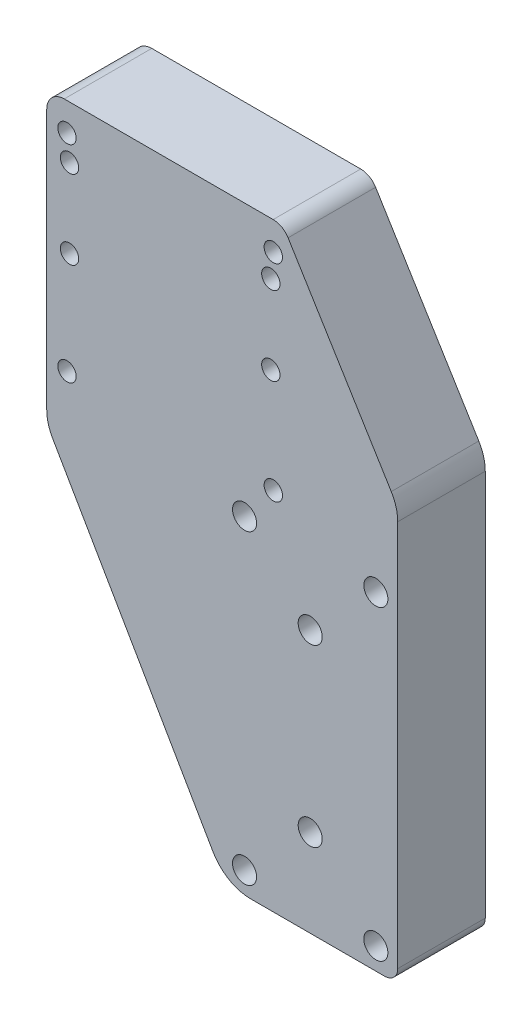
ISO-10303-21;
HEADER;
FILE_DESCRIPTION(('STEP AP214'),'2;1');
FILE_NAME('part.step','',(''),(''),'','','');
FILE_SCHEMA(('AUTOMOTIVE_DESIGN { 1 0 10303 214 1 1 1 1 }'));
ENDSEC;
DATA;
#1=APPLICATION_CONTEXT('core data for automotive mechanical design processes');
#2=APPLICATION_PROTOCOL_DEFINITION('international standard','automotive_design',2000,#1);
#3=PRODUCT_CONTEXT('',#1,'mechanical');
#4=PRODUCT('Part','Part','',(#3));
#5=PRODUCT_RELATED_PRODUCT_CATEGORY('part','',(#4));
#6=PRODUCT_DEFINITION_FORMATION('','',#4);
#7=PRODUCT_DEFINITION_CONTEXT('part definition',#1,'design');
#8=PRODUCT_DEFINITION('design','',#6,#7);
#9=PRODUCT_DEFINITION_SHAPE('','',#8);
#10=(LENGTH_UNIT() NAMED_UNIT(*) SI_UNIT(.MILLI.,.METRE.));
#11=(NAMED_UNIT(*) PLANE_ANGLE_UNIT() SI_UNIT($,.RADIAN.));
#12=(NAMED_UNIT(*) SI_UNIT($,.STERADIAN.) SOLID_ANGLE_UNIT());
#13=UNCERTAINTY_MEASURE_WITH_UNIT(LENGTH_MEASURE(1.E-05),#10,'distance_accuracy_value','');
#14=(GEOMETRIC_REPRESENTATION_CONTEXT(3) GLOBAL_UNCERTAINTY_ASSIGNED_CONTEXT((#13)) GLOBAL_UNIT_ASSIGNED_CONTEXT((#10,
#11,#12)) REPRESENTATION_CONTEXT('',''));
#15=CARTESIAN_POINT('',(0.,0.,0.));
#16=DIRECTION('',(0.,0.,1.));
#17=DIRECTION('',(1.,0.,0.));
#18=AXIS2_PLACEMENT_3D('',#15,#16,#17);
#19=CARTESIAN_POINT('',(-92.9999999999341,473.,20.));
#20=DIRECTION('',(0.,0.,-1.));
#21=DIRECTION('',(-1.,0.,0.));
#22=AXIS2_PLACEMENT_3D('',#19,#20,#21);
#23=PLANE('',#22);
#24=CARTESIAN_POINT('',(-165.570000000788,553.43000000002,20.));
#25=DIRECTION('',(0.,0.,1.));
#26=DIRECTION('',(1.,0.,0.));
#27=AXIS2_PLACEMENT_3D('',#24,#25,#26);
#28=CIRCLE('',#27,2.09999999999999);
#29=CARTESIAN_POINT('',(-163.470000000788,553.43000000002,20.));
#30=VERTEX_POINT('',#29);
#31=EDGE_CURVE('E320',#30,#30,#28,.T.);
#32=ORIENTED_EDGE('',*,*,#31,.F.);
#33=EDGE_LOOP('',(#32));
#34=FACE_BOUND('',#33,.T.);
#35=CARTESIAN_POINT('',(-165.570000000788,600.57000000002,20.));
#36=DIRECTION('',(0.,0.,1.));
#37=DIRECTION('',(1.,0.,0.));
#38=AXIS2_PLACEMENT_3D('',#35,#36,#37);
#39=CIRCLE('',#38,2.09999999999999);
#40=CARTESIAN_POINT('',(-163.470000000788,600.57000000002,20.));
#41=VERTEX_POINT('',#40);
#42=EDGE_CURVE('E322',#41,#41,#39,.T.);
#43=ORIENTED_EDGE('',*,*,#42,.F.);
#44=EDGE_LOOP('',(#43));
#45=FACE_BOUND('',#44,.T.);
#46=CARTESIAN_POINT('',(-118.430000000788,553.43000000002,20.));
#47=DIRECTION('',(0.,0.,1.));
#48=DIRECTION('',(1.,0.,0.));
#49=AXIS2_PLACEMENT_3D('',#46,#47,#48);
#50=CIRCLE('',#49,2.1);
#51=CARTESIAN_POINT('',(-116.330000000788,553.43000000002,20.));
#52=VERTEX_POINT('',#51);
#53=EDGE_CURVE('E330',#52,#52,#50,.T.);
#54=ORIENTED_EDGE('',*,*,#53,.F.);
#55=EDGE_LOOP('',(#54));
#56=FACE_BOUND('',#55,.T.);
#57=CARTESIAN_POINT('',(-118.430000000788,600.57000000002,20.));
#58=DIRECTION('',(0.,0.,1.));
#59=DIRECTION('',(1.,0.,0.));
#60=AXIS2_PLACEMENT_3D('',#57,#58,#59);
#61=CIRCLE('',#60,2.1);
#62=CARTESIAN_POINT('',(-116.330000000788,600.57000000002,20.));
#63=VERTEX_POINT('',#62);
#64=EDGE_CURVE('E336',#63,#63,#61,.T.);
#65=ORIENTED_EDGE('',*,*,#64,.F.);
#66=EDGE_LOOP('',(#65));
#67=FACE_BOUND('',#66,.T.);
#68=CARTESIAN_POINT('',(-94.999999999934,544.999999999999,20.));
#69=DIRECTION('',(0.,0.,1.));
#70=DIRECTION('',(1.,0.,0.));
#71=AXIS2_PLACEMENT_3D('',#68,#69,#70);
#72=CIRCLE('',#71,2.75);
#73=CARTESIAN_POINT('',(-92.249999999934,544.999999999999,20.));
#74=VERTEX_POINT('',#73);
#75=EDGE_CURVE('E342',#74,#74,#72,.T.);
#76=ORIENTED_EDGE('',*,*,#75,.F.);
#77=EDGE_LOOP('',(#76));
#78=FACE_BOUND('',#77,.T.);
#79=CARTESIAN_POINT('',(-124.999999999934,544.999999999999,20.));
#80=DIRECTION('',(0.,0.,1.));
#81=DIRECTION('',(1.,0.,0.));
#82=AXIS2_PLACEMENT_3D('',#79,#80,#81);
#83=CIRCLE('',#82,2.75);
#84=CARTESIAN_POINT('',(-122.249999999934,544.999999999999,20.));
#85=VERTEX_POINT('',#84);
#86=EDGE_CURVE('E348',#85,#85,#83,.T.);
#87=ORIENTED_EDGE('',*,*,#86,.F.);
#88=EDGE_LOOP('',(#87));
#89=FACE_BOUND('',#88,.T.);
#90=CARTESIAN_POINT('',(-94.999999999934,475.,20.));
#91=DIRECTION('',(0.,0.,1.));
#92=DIRECTION('',(1.,0.,0.));
#93=AXIS2_PLACEMENT_3D('',#90,#91,#92);
#94=CIRCLE('',#93,2.75);
#95=CARTESIAN_POINT('',(-92.249999999934,475.,20.));
#96=VERTEX_POINT('',#95);
#97=EDGE_CURVE('E360',#96,#96,#94,.T.);
#98=ORIENTED_EDGE('',*,*,#97,.F.);
#99=EDGE_LOOP('',(#98));
#100=FACE_BOUND('',#99,.T.);
#101=CARTESIAN_POINT('',(-109.999999999934,490.,20.));
#102=DIRECTION('',(0.,0.,1.));
#103=DIRECTION('',(1.,0.,0.));
#104=AXIS2_PLACEMENT_3D('',#101,#102,#103);
#105=CIRCLE('',#104,2.75);
#106=CARTESIAN_POINT('',(-107.249999999934,490.,20.));
#107=VERTEX_POINT('',#106);
#108=EDGE_CURVE('E366',#107,#107,#105,.T.);
#109=ORIENTED_EDGE('',*,*,#108,.F.);
#110=EDGE_LOOP('',(#109));
#111=FACE_BOUND('',#110,.T.);
#112=CARTESIAN_POINT('',(-109.999999999934,530.,20.));
#113=DIRECTION('',(0.,0.,1.));
#114=DIRECTION('',(1.,0.,0.));
#115=AXIS2_PLACEMENT_3D('',#112,#113,#114);
#116=CIRCLE('',#115,2.75);
#117=CARTESIAN_POINT('',(-107.249999999934,530.,20.));
#118=VERTEX_POINT('',#117);
#119=EDGE_CURVE('E372',#118,#118,#116,.T.);
#120=ORIENTED_EDGE('',*,*,#119,.F.);
#121=EDGE_LOOP('',(#120));
#122=FACE_BOUND('',#121,.T.);
#123=CARTESIAN_POINT('',(-119.000000000783,595.000000000015,20.));
#124=DIRECTION('',(0.,0.,-1.));
#125=DIRECTION('',(-1.,0.,0.));
#126=AXIS2_PLACEMENT_3D('',#123,#124,#125);
#127=CIRCLE('',#126,2.09999999999999);
#128=CARTESIAN_POINT('',(-121.100000000783,595.000000000015,20.));
#129=VERTEX_POINT('',#128);
#130=EDGE_CURVE('E381',#129,#129,#127,.T.);
#131=ORIENTED_EDGE('',*,*,#130,.T.);
#132=EDGE_LOOP('',(#131));
#133=FACE_BOUND('',#132,.T.);
#134=CARTESIAN_POINT('',(-119.000000000783,577.000000000015,20.));
#135=DIRECTION('',(0.,0.,-1.));
#136=DIRECTION('',(-1.,0.,0.));
#137=AXIS2_PLACEMENT_3D('',#134,#135,#136);
#138=CIRCLE('',#137,2.09999999999999);
#139=CARTESIAN_POINT('',(-121.100000000783,577.000000000015,20.));
#140=VERTEX_POINT('',#139);
#141=EDGE_CURVE('E387',#140,#140,#138,.T.);
#142=ORIENTED_EDGE('',*,*,#141,.T.);
#143=EDGE_LOOP('',(#142));
#144=FACE_BOUND('',#143,.T.);
#145=CARTESIAN_POINT('',(-165.000000000784,577.000000000014,20.));
#146=DIRECTION('',(0.,0.,-1.));
#147=DIRECTION('',(-1.,0.,0.));
#148=AXIS2_PLACEMENT_3D('',#145,#146,#147);
#149=CIRCLE('',#148,2.09999999999999);
#150=CARTESIAN_POINT('',(-167.100000000784,577.000000000014,20.));
#151=VERTEX_POINT('',#150);
#152=EDGE_CURVE('E393',#151,#151,#149,.T.);
#153=ORIENTED_EDGE('',*,*,#152,.T.);
#154=EDGE_LOOP('',(#153));
#155=FACE_BOUND('',#154,.T.);
#156=CARTESIAN_POINT('',(-165.000000000783,595.000000000014,20.));
#157=DIRECTION('',(0.,0.,-1.));
#158=DIRECTION('',(-1.,0.,0.));
#159=AXIS2_PLACEMENT_3D('',#156,#157,#158);
#160=CIRCLE('',#159,2.09999999999999);
#161=CARTESIAN_POINT('',(-167.100000000783,595.000000000014,20.));
#162=VERTEX_POINT('',#161);
#163=EDGE_CURVE('E162',#162,#162,#160,.T.);
#164=ORIENTED_EDGE('',*,*,#163,.T.);
#165=EDGE_LOOP('',(#164));
#166=FACE_BOUND('',#165,.T.);
#167=DIRECTION('',(-0.522952630183533,0.852361746316741,0.));
#168=VECTOR('',#167,1.);
#169=CARTESIAN_POINT('',(-116.22532923768,606.999999999993,20.));
#170=LINE('',#169,#168);
#171=CARTESIAN_POINT('',(-91.4763825367658,566.661632408099,20.));
#172=VERTEX_POINT('',#171);
#173=CARTESIAN_POINT('',(-115.054590743862,605.091810520727,20.));
#174=VERTEX_POINT('',#173);
#175=EDGE_CURVE('E153',#172,#174,#170,.T.);
#176=ORIENTED_EDGE('',*,*,#175,.T.);
#177=CARTESIAN_POINT('',(-118.464037729129,602.999999999993,20.));
#178=DIRECTION('',(0.,0.,-1.));
#179=DIRECTION('',(-1.,0.,0.));
#180=AXIS2_PLACEMENT_3D('',#177,#178,#179);
#181=CIRCLE('',#180,4.);
#182=CARTESIAN_POINT('',(-118.464037729129,606.999999999993,20.));
#183=VERTEX_POINT('',#182);
#184=EDGE_CURVE('E41',#174,#183,#181,.F.);
#185=ORIENTED_EDGE('',*,*,#184,.T.);
#186=DIRECTION('',(-1.,0.,0.));
#187=VECTOR('',#186,1.);
#188=CARTESIAN_POINT('',(-170.200000000702,606.999999999993,20.));
#189=LINE('',#188,#187);
#190=CARTESIAN_POINT('',(-166.200000000702,606.999999999993,20.));
#191=VERTEX_POINT('',#190);
#192=EDGE_CURVE('E175',#183,#191,#189,.T.);
#193=ORIENTED_EDGE('',*,*,#192,.T.);
#194=CARTESIAN_POINT('',(-166.200000000702,602.999999999993,20.));
#195=DIRECTION('',(0.,0.,-1.));
#196=DIRECTION('',(-1.,0.,0.));
#197=AXIS2_PLACEMENT_3D('',#194,#195,#196);
#198=CIRCLE('',#197,4.);
#199=CARTESIAN_POINT('',(-170.200000000702,602.999999999993,20.));
#200=VERTEX_POINT('',#199);
#201=EDGE_CURVE('E48',#191,#200,#198,.F.);
#202=ORIENTED_EDGE('',*,*,#201,.T.);
#203=DIRECTION('',(0.,-1.,0.));
#204=VECTOR('',#203,1.);
#205=CARTESIAN_POINT('',(-170.200000000702,540.82459488831,20.));
#206=LINE('',#205,#204);
#207=CARTESIAN_POINT('',(-170.200000000702,543.504086812621,20.));
#208=VERTEX_POINT('',#207);
#209=EDGE_CURVE('E221',#200,#208,#206,.T.);
#210=ORIENTED_EDGE('',*,*,#209,.T.);
#211=CARTESIAN_POINT('',(-160.200000000702,543.504086812621,20.));
#212=DIRECTION('',(0.,0.,-1.));
#213=DIRECTION('',(-1.,0.,0.));
#214=AXIS2_PLACEMENT_3D('',#211,#212,#213);
#215=CIRCLE('',#214,10.);
#216=CARTESIAN_POINT('',(-168.860254038547,538.504086812621,20.));
#217=VERTEX_POINT('',#216);
#218=EDGE_CURVE('E192',#208,#217,#215,.F.);
#219=ORIENTED_EDGE('',*,*,#218,.T.);
#220=DIRECTION('',(0.5,-0.866025403784438,0.));
#221=VECTOR('',#220,1.);
#222=CARTESIAN_POINT('',(-170.200000000702,540.82459488831,20.));
#223=LINE('',#222,#221);
#224=CARTESIAN_POINT('',(-132.196152422639,475.000000000001,20.));
#225=VERTEX_POINT('',#224);
#226=EDGE_CURVE('E136',#217,#225,#223,.T.);
#227=ORIENTED_EDGE('',*,*,#226,.T.);
#228=CARTESIAN_POINT('',(-123.535898384794,480.000000000001,20.));
#229=DIRECTION('',(0.,0.,-1.));
#230=DIRECTION('',(-1.,0.,0.));
#231=AXIS2_PLACEMENT_3D('',#228,#229,#230);
#232=CIRCLE('',#231,10.);
#233=CARTESIAN_POINT('',(-123.535898384794,470.000000000001,20.));
#234=VERTEX_POINT('',#233);
#235=EDGE_CURVE('E132',#225,#234,#232,.F.);
#236=ORIENTED_EDGE('',*,*,#235,.T.);
#237=DIRECTION('',(1.,0.,0.));
#238=VECTOR('',#237,1.);
#239=CARTESIAN_POINT('',(-129.30940107669,470.000000000001,20.));
#240=LINE('',#239,#238);
#241=CARTESIAN_POINT('',(-92.9999999999341,470.,20.));
#242=VERTEX_POINT('',#241);
#243=EDGE_CURVE('E123',#234,#242,#240,.T.);
#244=ORIENTED_EDGE('',*,*,#243,.T.);
#245=CARTESIAN_POINT('',(-92.9999999999341,473.,20.));
#246=DIRECTION('',(0.,0.,1.));
#247=DIRECTION('',(-1.,0.,0.));
#248=AXIS2_PLACEMENT_3D('',#245,#246,#247);
#249=CIRCLE('',#248,3.);
#250=CARTESIAN_POINT('',(-89.9999999999341,473.,20.));
#251=VERTEX_POINT('',#250);
#252=EDGE_CURVE('E128',#242,#251,#249,.T.);
#253=ORIENTED_EDGE('',*,*,#252,.T.);
#254=DIRECTION('',(0.,1.,0.));
#255=VECTOR('',#254,1.);
#256=CARTESIAN_POINT('',(-89.9999999999341,473.,20.));
#257=LINE('',#256,#255);
#258=CARTESIAN_POINT('',(-89.9999999999332,561.432106106264,20.));
#259=VERTEX_POINT('',#258);
#260=EDGE_CURVE('E151',#251,#259,#257,.T.);
#261=ORIENTED_EDGE('',*,*,#260,.T.);
#262=CARTESIAN_POINT('',(-99.9999999999332,561.432106106264,20.));
#263=DIRECTION('',(0.,0.,-1.));
#264=DIRECTION('',(-1.,0.,0.));
#265=AXIS2_PLACEMENT_3D('',#262,#263,#264);
#266=CIRCLE('',#265,10.);
#267=EDGE_CURVE('E190',#259,#172,#266,.F.);
#268=ORIENTED_EDGE('',*,*,#267,.T.);
#269=EDGE_LOOP('',(#176,#185,#193,#202,#210,#219,#227,#236,#244,#253,#261,#268));
#270=FACE_BOUND('',#269,.T.);
#271=CARTESIAN_POINT('',(-124.999999999934,475.,20.));
#272=DIRECTION('',(0.,0.,1.));
#273=DIRECTION('',(1.,0.,0.));
#274=AXIS2_PLACEMENT_3D('',#271,#272,#273);
#275=CIRCLE('',#274,2.75);
#276=CARTESIAN_POINT('',(-122.249999999934,475.,20.));
#277=VERTEX_POINT('',#276);
#278=EDGE_CURVE('E354',#277,#277,#275,.T.);
#279=ORIENTED_EDGE('',*,*,#278,.F.);
#280=EDGE_LOOP('',(#279));
#281=FACE_BOUND('',#280,.T.);
#282=ADVANCED_FACE('F33',(#34,#45,#56,#67,#78,#89,#100,#111,#122,#133,#144,#155,#166,#270,#281),
#23,.F.);
#283=CARTESIAN_POINT('',(-92.9999999999341,473.,0.));
#284=DIRECTION('',(0.,0.,-1.));
#285=DIRECTION('',(-1.,0.,0.));
#286=AXIS2_PLACEMENT_3D('',#283,#284,#285);
#287=PLANE('',#286);
#288=CARTESIAN_POINT('',(-165.570000000788,553.43000000002,0.));
#289=DIRECTION('',(0.,0.,1.));
#290=DIRECTION('',(1.,0.,0.));
#291=AXIS2_PLACEMENT_3D('',#288,#289,#290);
#292=CIRCLE('',#291,2.09999999999999);
#293=CARTESIAN_POINT('',(-163.470000000788,553.43000000002,0.));
#294=VERTEX_POINT('',#293);
#295=EDGE_CURVE('E318',#294,#294,#292,.T.);
#296=ORIENTED_EDGE('',*,*,#295,.T.);
#297=EDGE_LOOP('',(#296));
#298=FACE_BOUND('',#297,.T.);
#299=CARTESIAN_POINT('',(-165.570000000788,600.57000000002,0.));
#300=DIRECTION('',(0.,0.,1.));
#301=DIRECTION('',(1.,0.,0.));
#302=AXIS2_PLACEMENT_3D('',#299,#300,#301);
#303=CIRCLE('',#302,2.09999999999999);
#304=CARTESIAN_POINT('',(-163.470000000788,600.57000000002,0.));
#305=VERTEX_POINT('',#304);
#306=EDGE_CURVE('E327',#305,#305,#303,.T.);
#307=ORIENTED_EDGE('',*,*,#306,.T.);
#308=EDGE_LOOP('',(#307));
#309=FACE_BOUND('',#308,.T.);
#310=CARTESIAN_POINT('',(-118.430000000788,553.43000000002,0.));
#311=DIRECTION('',(0.,0.,1.));
#312=DIRECTION('',(1.,0.,0.));
#313=AXIS2_PLACEMENT_3D('',#310,#311,#312);
#314=CIRCLE('',#313,2.09999999999999);
#315=CARTESIAN_POINT('',(-116.330000000788,553.43000000002,0.));
#316=VERTEX_POINT('',#315);
#317=EDGE_CURVE('E333',#316,#316,#314,.T.);
#318=ORIENTED_EDGE('',*,*,#317,.T.);
#319=EDGE_LOOP('',(#318));
#320=FACE_BOUND('',#319,.T.);
#321=CARTESIAN_POINT('',(-118.430000000788,600.57000000002,0.));
#322=DIRECTION('',(0.,0.,1.));
#323=DIRECTION('',(1.,0.,0.));
#324=AXIS2_PLACEMENT_3D('',#321,#322,#323);
#325=CIRCLE('',#324,2.09999999999999);
#326=CARTESIAN_POINT('',(-116.330000000788,600.57000000002,0.));
#327=VERTEX_POINT('',#326);
#328=EDGE_CURVE('E339',#327,#327,#325,.T.);
#329=ORIENTED_EDGE('',*,*,#328,.T.);
#330=EDGE_LOOP('',(#329));
#331=FACE_BOUND('',#330,.T.);
#332=CARTESIAN_POINT('',(-94.999999999934,544.999999999999,0.));
#333=DIRECTION('',(0.,0.,1.));
#334=DIRECTION('',(1.,0.,0.));
#335=AXIS2_PLACEMENT_3D('',#332,#333,#334);
#336=CIRCLE('',#335,2.74999999999999);
#337=CARTESIAN_POINT('',(-92.249999999934,544.999999999999,0.));
#338=VERTEX_POINT('',#337);
#339=EDGE_CURVE('E345',#338,#338,#336,.T.);
#340=ORIENTED_EDGE('',*,*,#339,.T.);
#341=EDGE_LOOP('',(#340));
#342=FACE_BOUND('',#341,.T.);
#343=CARTESIAN_POINT('',(-124.999999999934,544.999999999999,0.));
#344=DIRECTION('',(0.,0.,1.));
#345=DIRECTION('',(1.,0.,0.));
#346=AXIS2_PLACEMENT_3D('',#343,#344,#345);
#347=CIRCLE('',#346,2.74999999999999);
#348=CARTESIAN_POINT('',(-122.249999999934,544.999999999999,0.));
#349=VERTEX_POINT('',#348);
#350=EDGE_CURVE('E351',#349,#349,#347,.T.);
#351=ORIENTED_EDGE('',*,*,#350,.T.);
#352=EDGE_LOOP('',(#351));
#353=FACE_BOUND('',#352,.T.);
#354=CARTESIAN_POINT('',(-124.999999999934,475.,0.));
#355=DIRECTION('',(0.,0.,1.));
#356=DIRECTION('',(1.,0.,0.));
#357=AXIS2_PLACEMENT_3D('',#354,#355,#356);
#358=CIRCLE('',#357,2.74999999999999);
#359=CARTESIAN_POINT('',(-122.249999999934,475.,0.));
#360=VERTEX_POINT('',#359);
#361=EDGE_CURVE('E357',#360,#360,#358,.T.);
#362=ORIENTED_EDGE('',*,*,#361,.T.);
#363=EDGE_LOOP('',(#362));
#364=FACE_BOUND('',#363,.T.);
#365=CARTESIAN_POINT('',(-94.999999999934,475.,0.));
#366=DIRECTION('',(0.,0.,1.));
#367=DIRECTION('',(1.,0.,0.));
#368=AXIS2_PLACEMENT_3D('',#365,#366,#367);
#369=CIRCLE('',#368,2.74999999999999);
#370=CARTESIAN_POINT('',(-92.249999999934,475.,0.));
#371=VERTEX_POINT('',#370);
#372=EDGE_CURVE('E363',#371,#371,#369,.T.);
#373=ORIENTED_EDGE('',*,*,#372,.T.);
#374=EDGE_LOOP('',(#373));
#375=FACE_BOUND('',#374,.T.);
#376=DIRECTION('',(-1.,0.,0.));
#377=VECTOR('',#376,1.);
#378=CARTESIAN_POINT('',(-170.200000000702,606.999999999993,0.));
#379=LINE('',#378,#377);
#380=CARTESIAN_POINT('',(-118.464037729129,606.999999999993,0.));
#381=VERTEX_POINT('',#380);
#382=CARTESIAN_POINT('',(-166.200000000702,606.999999999993,0.));
#383=VERTEX_POINT('',#382);
#384=EDGE_CURVE('E158',#381,#383,#379,.T.);
#385=ORIENTED_EDGE('',*,*,#384,.F.);
#386=CARTESIAN_POINT('',(-118.464037729129,602.999999999993,0.));
#387=DIRECTION('',(0.,0.,-1.));
#388=DIRECTION('',(-1.,0.,0.));
#389=AXIS2_PLACEMENT_3D('',#386,#387,#388);
#390=CIRCLE('',#389,4.);
#391=CARTESIAN_POINT('',(-115.054590743862,605.091810520727,0.));
#392=VERTEX_POINT('',#391);
#393=EDGE_CURVE('E210',#381,#392,#390,.T.);
#394=ORIENTED_EDGE('',*,*,#393,.T.);
#395=DIRECTION('',(-0.522952630183533,0.852361746316741,0.));
#396=VECTOR('',#395,1.);
#397=CARTESIAN_POINT('',(-116.22532923768,606.999999999993,0.));
#398=LINE('',#397,#396);
#399=CARTESIAN_POINT('',(-91.4763825367658,566.661632408099,0.));
#400=VERTEX_POINT('',#399);
#401=EDGE_CURVE('E173',#400,#392,#398,.T.);
#402=ORIENTED_EDGE('',*,*,#401,.F.);
#403=CARTESIAN_POINT('',(-99.9999999999332,561.432106106264,0.));
#404=DIRECTION('',(0.,0.,-1.));
#405=DIRECTION('',(-1.,0.,0.));
#406=AXIS2_PLACEMENT_3D('',#403,#404,#405);
#407=CIRCLE('',#406,10.);
#408=CARTESIAN_POINT('',(-89.9999999999332,561.432106106264,0.));
#409=VERTEX_POINT('',#408);
#410=EDGE_CURVE('E178',#400,#409,#407,.T.);
#411=ORIENTED_EDGE('',*,*,#410,.T.);
#412=DIRECTION('',(0.,1.,0.));
#413=VECTOR('',#412,1.);
#414=CARTESIAN_POINT('',(-89.9999999999341,473.,0.));
#415=LINE('',#414,#413);
#416=CARTESIAN_POINT('',(-89.9999999999341,473.,0.));
#417=VERTEX_POINT('',#416);
#418=EDGE_CURVE('E170',#417,#409,#415,.T.);
#419=ORIENTED_EDGE('',*,*,#418,.F.);
#420=CARTESIAN_POINT('',(-92.9999999999341,473.,0.));
#421=DIRECTION('',(0.,0.,1.));
#422=DIRECTION('',(-1.,0.,0.));
#423=AXIS2_PLACEMENT_3D('',#420,#421,#422);
#424=CIRCLE('',#423,3.);
#425=CARTESIAN_POINT('',(-92.9999999999341,470.,0.));
#426=VERTEX_POINT('',#425);
#427=EDGE_CURVE('E168',#426,#417,#424,.T.);
#428=ORIENTED_EDGE('',*,*,#427,.F.);
#429=DIRECTION('',(1.,0.,0.));
#430=VECTOR('',#429,1.);
#431=CARTESIAN_POINT('',(-129.30940107669,470.000000000001,0.));
#432=LINE('',#431,#430);
#433=CARTESIAN_POINT('',(-123.535898384794,470.000000000001,0.));
#434=VERTEX_POINT('',#433);
#435=EDGE_CURVE('E142',#434,#426,#432,.T.);
#436=ORIENTED_EDGE('',*,*,#435,.F.);
#437=CARTESIAN_POINT('',(-123.535898384794,480.000000000001,0.));
#438=DIRECTION('',(0.,0.,-1.));
#439=DIRECTION('',(-1.,0.,0.));
#440=AXIS2_PLACEMENT_3D('',#437,#438,#439);
#441=CIRCLE('',#440,10.);
#442=CARTESIAN_POINT('',(-132.196152422639,475.000000000001,0.));
#443=VERTEX_POINT('',#442);
#444=EDGE_CURVE('E183',#434,#443,#441,.T.);
#445=ORIENTED_EDGE('',*,*,#444,.T.);
#446=DIRECTION('',(0.5,-0.866025403784438,0.));
#447=VECTOR('',#446,1.);
#448=CARTESIAN_POINT('',(-170.200000000702,540.82459488831,0.));
#449=LINE('',#448,#447);
#450=CARTESIAN_POINT('',(-168.860254038547,538.504086812621,0.));
#451=VERTEX_POINT('',#450);
#452=EDGE_CURVE('E164',#451,#443,#449,.T.);
#453=ORIENTED_EDGE('',*,*,#452,.F.);
#454=CARTESIAN_POINT('',(-160.200000000702,543.504086812621,0.));
#455=DIRECTION('',(0.,0.,-1.));
#456=DIRECTION('',(-1.,0.,0.));
#457=AXIS2_PLACEMENT_3D('',#454,#455,#456);
#458=CIRCLE('',#457,10.);
#459=CARTESIAN_POINT('',(-170.200000000702,543.504086812621,0.));
#460=VERTEX_POINT('',#459);
#461=EDGE_CURVE('E180',#451,#460,#458,.T.);
#462=ORIENTED_EDGE('',*,*,#461,.T.);
#463=DIRECTION('',(0.,-1.,0.));
#464=VECTOR('',#463,1.);
#465=CARTESIAN_POINT('',(-170.200000000702,540.82459488831,0.));
#466=LINE('',#465,#464);
#467=CARTESIAN_POINT('',(-170.200000000702,602.999999999993,0.));
#468=VERTEX_POINT('',#467);
#469=EDGE_CURVE('E161',#468,#460,#466,.T.);
#470=ORIENTED_EDGE('',*,*,#469,.F.);
#471=CARTESIAN_POINT('',(-166.200000000702,602.999999999993,0.));
#472=DIRECTION('',(0.,0.,-1.));
#473=DIRECTION('',(-1.,0.,0.));
#474=AXIS2_PLACEMENT_3D('',#471,#472,#473);
#475=CIRCLE('',#474,4.);
#476=EDGE_CURVE('E208',#468,#383,#475,.T.);
#477=ORIENTED_EDGE('',*,*,#476,.T.);
#478=EDGE_LOOP('',(#385,#394,#402,#411,#419,#428,#436,#445,#453,#462,#470,#477));
#479=FACE_BOUND('',#478,.T.);
#480=CARTESIAN_POINT('',(-165.000000000783,595.000000000014,0.));
#481=DIRECTION('',(0.,0.,-1.));
#482=DIRECTION('',(-1.,0.,0.));
#483=AXIS2_PLACEMENT_3D('',#480,#481,#482);
#484=CIRCLE('',#483,2.09999999999999);
#485=CARTESIAN_POINT('',(-167.100000000783,595.000000000014,0.));
#486=VERTEX_POINT('',#485);
#487=EDGE_CURVE('E396',#486,#486,#484,.T.);
#488=ORIENTED_EDGE('',*,*,#487,.F.);
#489=EDGE_LOOP('',(#488));
#490=FACE_BOUND('',#489,.T.);
#491=CARTESIAN_POINT('',(-165.000000000784,577.000000000014,0.));
#492=DIRECTION('',(0.,0.,-1.));
#493=DIRECTION('',(-1.,0.,0.));
#494=AXIS2_PLACEMENT_3D('',#491,#492,#493);
#495=CIRCLE('',#494,2.09999999999999);
#496=CARTESIAN_POINT('',(-167.100000000784,577.000000000014,0.));
#497=VERTEX_POINT('',#496);
#498=EDGE_CURVE('E390',#497,#497,#495,.T.);
#499=ORIENTED_EDGE('',*,*,#498,.F.);
#500=EDGE_LOOP('',(#499));
#501=FACE_BOUND('',#500,.T.);
#502=CARTESIAN_POINT('',(-119.000000000783,577.000000000015,0.));
#503=DIRECTION('',(0.,0.,-1.));
#504=DIRECTION('',(-1.,0.,0.));
#505=AXIS2_PLACEMENT_3D('',#502,#503,#504);
#506=CIRCLE('',#505,2.1);
#507=CARTESIAN_POINT('',(-121.100000000783,577.000000000015,0.));
#508=VERTEX_POINT('',#507);
#509=EDGE_CURVE('E384',#508,#508,#506,.T.);
#510=ORIENTED_EDGE('',*,*,#509,.F.);
#511=EDGE_LOOP('',(#510));
#512=FACE_BOUND('',#511,.T.);
#513=CARTESIAN_POINT('',(-119.000000000783,595.000000000015,0.));
#514=DIRECTION('',(0.,0.,-1.));
#515=DIRECTION('',(-1.,0.,0.));
#516=AXIS2_PLACEMENT_3D('',#513,#514,#515);
#517=CIRCLE('',#516,2.1);
#518=CARTESIAN_POINT('',(-121.100000000783,595.000000000015,0.));
#519=VERTEX_POINT('',#518);
#520=EDGE_CURVE('E378',#519,#519,#517,.T.);
#521=ORIENTED_EDGE('',*,*,#520,.F.);
#522=EDGE_LOOP('',(#521));
#523=FACE_BOUND('',#522,.T.);
#524=CARTESIAN_POINT('',(-109.999999999934,530.,0.));
#525=DIRECTION('',(0.,0.,1.));
#526=DIRECTION('',(1.,0.,0.));
#527=AXIS2_PLACEMENT_3D('',#524,#525,#526);
#528=CIRCLE('',#527,2.74999999999999);
#529=CARTESIAN_POINT('',(-107.249999999934,530.,0.));
#530=VERTEX_POINT('',#529);
#531=EDGE_CURVE('E375',#530,#530,#528,.T.);
#532=ORIENTED_EDGE('',*,*,#531,.T.);
#533=EDGE_LOOP('',(#532));
#534=FACE_BOUND('',#533,.T.);
#535=CARTESIAN_POINT('',(-109.999999999934,490.,0.));
#536=DIRECTION('',(0.,0.,1.));
#537=DIRECTION('',(1.,0.,0.));
#538=AXIS2_PLACEMENT_3D('',#535,#536,#537);
#539=CIRCLE('',#538,2.74999999999999);
#540=CARTESIAN_POINT('',(-107.249999999934,490.,0.));
#541=VERTEX_POINT('',#540);
#542=EDGE_CURVE('E369',#541,#541,#539,.T.);
#543=ORIENTED_EDGE('',*,*,#542,.T.);
#544=EDGE_LOOP('',(#543));
#545=FACE_BOUND('',#544,.T.);
#546=ADVANCED_FACE('F226',(#298,#309,#320,#331,#342,#353,#364,#375,#479,#490,#501,#512,#523,
#534,#545),#287,.T.);
#547=CARTESIAN_POINT('',(-170.200000000702,606.999999999993,20.));
#548=DIRECTION('',(0.,-1.,0.));
#549=DIRECTION('',(0.,0.,-1.));
#550=AXIS2_PLACEMENT_3D('',#547,#548,#549);
#551=PLANE('',#550);
#552=ORIENTED_EDGE('',*,*,#192,.F.);
#553=DIRECTION('',(0.,0.,-1.));
#554=VECTOR('',#553,1.);
#555=CARTESIAN_POINT('',(-118.464037729129,606.999999999993,20.));
#556=LINE('',#555,#554);
#557=EDGE_CURVE('E205',#183,#381,#556,.T.);
#558=ORIENTED_EDGE('',*,*,#557,.T.);
#559=ORIENTED_EDGE('',*,*,#384,.T.);
#560=DIRECTION('',(0.,0.,-1.));
#561=VECTOR('',#560,1.);
#562=CARTESIAN_POINT('',(-166.200000000702,606.999999999993,20.));
#563=LINE('',#562,#561);
#564=EDGE_CURVE('E203',#383,#191,#563,.F.);
#565=ORIENTED_EDGE('',*,*,#564,.T.);
#566=EDGE_LOOP('',(#552,#558,#559,#565));
#567=FACE_BOUND('',#566,.T.);
#568=ADVANCED_FACE('F218',(#567),#551,.F.);
#569=CARTESIAN_POINT('',(-170.200000000702,540.82459488831,20.));
#570=DIRECTION('',(1.,0.,0.));
#571=DIRECTION('',(0.,1.,0.));
#572=AXIS2_PLACEMENT_3D('',#569,#570,#571);
#573=PLANE('',#572);
#574=ORIENTED_EDGE('',*,*,#209,.F.);
#575=DIRECTION('',(0.,0.,-1.));
#576=VECTOR('',#575,1.);
#577=CARTESIAN_POINT('',(-170.200000000702,602.999999999993,20.));
#578=LINE('',#577,#576);
#579=EDGE_CURVE('E11',#200,#468,#578,.T.);
#580=ORIENTED_EDGE('',*,*,#579,.T.);
#581=ORIENTED_EDGE('',*,*,#469,.T.);
#582=DIRECTION('',(0.,0.,-1.));
#583=VECTOR('',#582,1.);
#584=CARTESIAN_POINT('',(-170.200000000702,543.504086812621,20.));
#585=LINE('',#584,#583);
#586=EDGE_CURVE('E195',#460,#208,#585,.F.);
#587=ORIENTED_EDGE('',*,*,#586,.T.);
#588=EDGE_LOOP('',(#574,#580,#581,#587));
#589=FACE_BOUND('',#588,.T.);
#590=ADVANCED_FACE('F414',(#589),#573,.F.);
#591=CARTESIAN_POINT('',(-170.200000000702,540.82459488831,20.));
#592=DIRECTION('',(0.866025403784438,0.5,0.));
#593=DIRECTION('',(-0.5,0.866025403784439,0.));
#594=AXIS2_PLACEMENT_3D('',#591,#592,#593);
#595=PLANE('',#594);
#596=ORIENTED_EDGE('',*,*,#452,.T.);
#597=DIRECTION('',(0.,0.,-1.));
#598=VECTOR('',#597,1.);
#599=CARTESIAN_POINT('',(-132.196152422639,475.000000000001,20.));
#600=LINE('',#599,#598);
#601=EDGE_CURVE('E188',#443,#225,#600,.F.);
#602=ORIENTED_EDGE('',*,*,#601,.T.);
#603=ORIENTED_EDGE('',*,*,#226,.F.);
#604=DIRECTION('',(0.,0.,-1.));
#605=VECTOR('',#604,1.);
#606=CARTESIAN_POINT('',(-168.860254038547,538.504086812621,20.));
#607=LINE('',#606,#605);
#608=EDGE_CURVE('E185',#217,#451,#607,.T.);
#609=ORIENTED_EDGE('',*,*,#608,.T.);
#610=EDGE_LOOP('',(#596,#602,#603,#609));
#611=FACE_BOUND('',#610,.T.);
#612=ADVANCED_FACE('F408',(#611),#595,.F.);
#613=CARTESIAN_POINT('',(-129.30940107669,470.000000000001,20.));
#614=DIRECTION('',(0.,1.,0.));
#615=DIRECTION('',(-1.,0.,0.));
#616=AXIS2_PLACEMENT_3D('',#613,#614,#615);
#617=PLANE('',#616);
#618=ORIENTED_EDGE('',*,*,#243,.F.);
#619=DIRECTION('',(0.,0.,-1.));
#620=VECTOR('',#619,1.);
#621=CARTESIAN_POINT('',(-123.535898384794,470.000000000001,20.));
#622=LINE('',#621,#620);
#623=EDGE_CURVE('E145',#234,#434,#622,.T.);
#624=ORIENTED_EDGE('',*,*,#623,.T.);
#625=ORIENTED_EDGE('',*,*,#435,.T.);
#626=DIRECTION('',(0.,0.,-1.));
#627=VECTOR('',#626,1.);
#628=CARTESIAN_POINT('',(-92.9999999999341,470.,20.));
#629=LINE('',#628,#627);
#630=EDGE_CURVE('E139',#242,#426,#629,.T.);
#631=ORIENTED_EDGE('',*,*,#630,.F.);
#632=EDGE_LOOP('',(#618,#624,#625,#631));
#633=FACE_BOUND('',#632,.T.);
#634=ADVANCED_FACE('F140',(#633),#617,.F.);
#635=CARTESIAN_POINT('',(-92.9999999999341,473.,20.));
#636=DIRECTION('',(0.,0.,-1.));
#637=DIRECTION('',(-1.,0.,0.));
#638=AXIS2_PLACEMENT_3D('',#635,#636,#637);
#639=CYLINDRICAL_SURFACE('',#638,3.);
#640=ORIENTED_EDGE('',*,*,#427,.T.);
#641=DIRECTION('',(0.,0.,-1.));
#642=VECTOR('',#641,1.);
#643=CARTESIAN_POINT('',(-89.9999999999341,473.,20.));
#644=LINE('',#643,#642);
#645=EDGE_CURVE('E146',#251,#417,#644,.T.);
#646=ORIENTED_EDGE('',*,*,#645,.F.);
#647=ORIENTED_EDGE('',*,*,#252,.F.);
#648=ORIENTED_EDGE('',*,*,#630,.T.);
#649=EDGE_LOOP('',(#640,#646,#647,#648));
#650=FACE_BOUND('',#649,.T.);
#651=ADVANCED_FACE('F148',(#650),#639,.T.);
#652=CARTESIAN_POINT('',(-89.9999999999341,473.,20.));
#653=DIRECTION('',(-1.,0.,0.));
#654=DIRECTION('',(0.,-1.,0.));
#655=AXIS2_PLACEMENT_3D('',#652,#653,#654);
#656=PLANE('',#655);
#657=ORIENTED_EDGE('',*,*,#418,.T.);
#658=DIRECTION('',(0.,0.,-1.));
#659=VECTOR('',#658,1.);
#660=CARTESIAN_POINT('',(-89.9999999999332,561.432106106264,20.));
#661=LINE('',#660,#659);
#662=EDGE_CURVE('E201',#409,#259,#661,.F.);
#663=ORIENTED_EDGE('',*,*,#662,.T.);
#664=ORIENTED_EDGE('',*,*,#260,.F.);
#665=ORIENTED_EDGE('',*,*,#645,.T.);
#666=EDGE_LOOP('',(#657,#663,#664,#665));
#667=FACE_BOUND('',#666,.T.);
#668=ADVANCED_FACE('F236',(#667),#656,.F.);
#669=CARTESIAN_POINT('',(-116.22532923768,606.999999999993,20.));
#670=DIRECTION('',(-0.852361746316741,-0.522952630183533,0.));
#671=DIRECTION('',(0.522952630183533,-0.852361746316741,0.));
#672=AXIS2_PLACEMENT_3D('',#669,#670,#671);
#673=PLANE('',#672);
#674=ORIENTED_EDGE('',*,*,#401,.T.);
#675=DIRECTION('',(0.,0.,-1.));
#676=VECTOR('',#675,1.);
#677=CARTESIAN_POINT('',(-115.054590743862,605.091810520727,20.));
#678=LINE('',#677,#676);
#679=EDGE_CURVE('E56',#392,#174,#678,.F.);
#680=ORIENTED_EDGE('',*,*,#679,.T.);
#681=ORIENTED_EDGE('',*,*,#175,.F.);
#682=DIRECTION('',(0.,0.,-1.));
#683=VECTOR('',#682,1.);
#684=CARTESIAN_POINT('',(-91.4763825367658,566.661632408099,20.));
#685=LINE('',#684,#683);
#686=EDGE_CURVE('E198',#172,#400,#685,.T.);
#687=ORIENTED_EDGE('',*,*,#686,.T.);
#688=EDGE_LOOP('',(#674,#680,#681,#687));
#689=FACE_BOUND('',#688,.T.);
#690=ADVANCED_FACE('F228',(#689),#673,.F.);
#691=CARTESIAN_POINT('',(-123.535898384794,480.000000000001,20.));
#692=DIRECTION('',(0.,0.,-1.));
#693=DIRECTION('',(-1.,0.,0.));
#694=AXIS2_PLACEMENT_3D('',#691,#692,#693);
#695=CYLINDRICAL_SURFACE('',#694,10.);
#696=ORIENTED_EDGE('',*,*,#235,.F.);
#697=ORIENTED_EDGE('',*,*,#601,.F.);
#698=ORIENTED_EDGE('',*,*,#444,.F.);
#699=ORIENTED_EDGE('',*,*,#623,.F.);
#700=EDGE_LOOP('',(#696,#697,#698,#699));
#701=FACE_BOUND('',#700,.T.);
#702=ADVANCED_FACE('F243',(#701),#695,.T.);
#703=CARTESIAN_POINT('',(-160.200000000702,543.504086812621,20.));
#704=DIRECTION('',(0.,0.,-1.));
#705=DIRECTION('',(-1.,0.,0.));
#706=AXIS2_PLACEMENT_3D('',#703,#704,#705);
#707=CYLINDRICAL_SURFACE('',#706,10.);
#708=ORIENTED_EDGE('',*,*,#218,.F.);
#709=ORIENTED_EDGE('',*,*,#586,.F.);
#710=ORIENTED_EDGE('',*,*,#461,.F.);
#711=ORIENTED_EDGE('',*,*,#608,.F.);
#712=EDGE_LOOP('',(#708,#709,#710,#711));
#713=FACE_BOUND('',#712,.T.);
#714=ADVANCED_FACE('F410',(#713),#707,.T.);
#715=CARTESIAN_POINT('',(-99.9999999999332,561.432106106264,20.));
#716=DIRECTION('',(0.,0.,-1.));
#717=DIRECTION('',(-1.,0.,0.));
#718=AXIS2_PLACEMENT_3D('',#715,#716,#717);
#719=CYLINDRICAL_SURFACE('',#718,10.);
#720=ORIENTED_EDGE('',*,*,#267,.F.);
#721=ORIENTED_EDGE('',*,*,#662,.F.);
#722=ORIENTED_EDGE('',*,*,#410,.F.);
#723=ORIENTED_EDGE('',*,*,#686,.F.);
#724=EDGE_LOOP('',(#720,#721,#722,#723));
#725=FACE_BOUND('',#724,.T.);
#726=ADVANCED_FACE('F232',(#725),#719,.T.);
#727=CARTESIAN_POINT('',(-165.000000000783,595.000000000014,0.));
#728=DIRECTION('',(0.,0.,-1.));
#729=DIRECTION('',(-1.,0.,0.));
#730=AXIS2_PLACEMENT_3D('',#727,#728,#729);
#731=CYLINDRICAL_SURFACE('',#730,2.09999999999999);
#732=ORIENTED_EDGE('',*,*,#163,.F.);
#733=EDGE_LOOP('',(#732));
#734=FACE_BOUND('',#733,.T.);
#735=ORIENTED_EDGE('',*,*,#487,.T.);
#736=EDGE_LOOP('',(#735));
#737=FACE_BOUND('',#736,.T.);
#738=ADVANCED_FACE('F257',(#734,#737),#731,.F.);
#739=CARTESIAN_POINT('',(-165.000000000784,577.000000000014,0.));
#740=DIRECTION('',(0.,0.,-1.));
#741=DIRECTION('',(-1.,0.,0.));
#742=AXIS2_PLACEMENT_3D('',#739,#740,#741);
#743=CYLINDRICAL_SURFACE('',#742,2.09999999999999);
#744=ORIENTED_EDGE('',*,*,#152,.F.);
#745=EDGE_LOOP('',(#744));
#746=FACE_BOUND('',#745,.T.);
#747=ORIENTED_EDGE('',*,*,#498,.T.);
#748=EDGE_LOOP('',(#747));
#749=FACE_BOUND('',#748,.T.);
#750=ADVANCED_FACE('F260',(#746,#749),#743,.F.);
#751=CARTESIAN_POINT('',(-119.000000000783,577.000000000015,0.));
#752=DIRECTION('',(0.,0.,-1.));
#753=DIRECTION('',(-1.,0.,0.));
#754=AXIS2_PLACEMENT_3D('',#751,#752,#753);
#755=CYLINDRICAL_SURFACE('',#754,2.1);
#756=ORIENTED_EDGE('',*,*,#141,.F.);
#757=EDGE_LOOP('',(#756));
#758=FACE_BOUND('',#757,.T.);
#759=ORIENTED_EDGE('',*,*,#509,.T.);
#760=EDGE_LOOP('',(#759));
#761=FACE_BOUND('',#760,.T.);
#762=ADVANCED_FACE('F264',(#758,#761),#755,.F.);
#763=CARTESIAN_POINT('',(-119.000000000783,595.000000000015,0.));
#764=DIRECTION('',(0.,0.,-1.));
#765=DIRECTION('',(-1.,0.,0.));
#766=AXIS2_PLACEMENT_3D('',#763,#764,#765);
#767=CYLINDRICAL_SURFACE('',#766,2.1);
#768=ORIENTED_EDGE('',*,*,#130,.F.);
#769=EDGE_LOOP('',(#768));
#770=FACE_BOUND('',#769,.T.);
#771=ORIENTED_EDGE('',*,*,#520,.T.);
#772=EDGE_LOOP('',(#771));
#773=FACE_BOUND('',#772,.T.);
#774=ADVANCED_FACE('F268',(#770,#773),#767,.F.);
#775=CARTESIAN_POINT('',(-109.999999999934,530.,20.));
#776=DIRECTION('',(0.,0.,1.));
#777=DIRECTION('',(1.,0.,0.));
#778=AXIS2_PLACEMENT_3D('',#775,#776,#777);
#779=CYLINDRICAL_SURFACE('',#778,2.75);
#780=ORIENTED_EDGE('',*,*,#531,.F.);
#781=EDGE_LOOP('',(#780));
#782=FACE_BOUND('',#781,.T.);
#783=ORIENTED_EDGE('',*,*,#119,.T.);
#784=EDGE_LOOP('',(#783));
#785=FACE_BOUND('',#784,.T.);
#786=ADVANCED_FACE('F272',(#782,#785),#779,.F.);
#787=CARTESIAN_POINT('',(-109.999999999934,490.,20.));
#788=DIRECTION('',(0.,0.,1.));
#789=DIRECTION('',(1.,0.,0.));
#790=AXIS2_PLACEMENT_3D('',#787,#788,#789);
#791=CYLINDRICAL_SURFACE('',#790,2.75);
#792=ORIENTED_EDGE('',*,*,#542,.F.);
#793=EDGE_LOOP('',(#792));
#794=FACE_BOUND('',#793,.T.);
#795=ORIENTED_EDGE('',*,*,#108,.T.);
#796=EDGE_LOOP('',(#795));
#797=FACE_BOUND('',#796,.T.);
#798=ADVANCED_FACE('F276',(#794,#797),#791,.F.);
#799=CARTESIAN_POINT('',(-94.999999999934,475.,20.));
#800=DIRECTION('',(0.,0.,1.));
#801=DIRECTION('',(1.,0.,0.));
#802=AXIS2_PLACEMENT_3D('',#799,#800,#801);
#803=CYLINDRICAL_SURFACE('',#802,2.75);
#804=ORIENTED_EDGE('',*,*,#372,.F.);
#805=EDGE_LOOP('',(#804));
#806=FACE_BOUND('',#805,.T.);
#807=ORIENTED_EDGE('',*,*,#97,.T.);
#808=EDGE_LOOP('',(#807));
#809=FACE_BOUND('',#808,.T.);
#810=ADVANCED_FACE('F280',(#806,#809),#803,.F.);
#811=CARTESIAN_POINT('',(-124.999999999934,475.,20.));
#812=DIRECTION('',(0.,0.,1.));
#813=DIRECTION('',(1.,0.,0.));
#814=AXIS2_PLACEMENT_3D('',#811,#812,#813);
#815=CYLINDRICAL_SURFACE('',#814,2.75);
#816=ORIENTED_EDGE('',*,*,#361,.F.);
#817=EDGE_LOOP('',(#816));
#818=FACE_BOUND('',#817,.T.);
#819=ORIENTED_EDGE('',*,*,#278,.T.);
#820=EDGE_LOOP('',(#819));
#821=FACE_BOUND('',#820,.T.);
#822=ADVANCED_FACE('F284',(#818,#821),#815,.F.);
#823=CARTESIAN_POINT('',(-124.999999999934,544.999999999999,20.));
#824=DIRECTION('',(0.,0.,1.));
#825=DIRECTION('',(1.,0.,0.));
#826=AXIS2_PLACEMENT_3D('',#823,#824,#825);
#827=CYLINDRICAL_SURFACE('',#826,2.75);
#828=ORIENTED_EDGE('',*,*,#350,.F.);
#829=EDGE_LOOP('',(#828));
#830=FACE_BOUND('',#829,.T.);
#831=ORIENTED_EDGE('',*,*,#86,.T.);
#832=EDGE_LOOP('',(#831));
#833=FACE_BOUND('',#832,.T.);
#834=ADVANCED_FACE('F288',(#830,#833),#827,.F.);
#835=CARTESIAN_POINT('',(-94.999999999934,544.999999999999,20.));
#836=DIRECTION('',(0.,0.,1.));
#837=DIRECTION('',(1.,0.,0.));
#838=AXIS2_PLACEMENT_3D('',#835,#836,#837);
#839=CYLINDRICAL_SURFACE('',#838,2.75);
#840=ORIENTED_EDGE('',*,*,#339,.F.);
#841=EDGE_LOOP('',(#840));
#842=FACE_BOUND('',#841,.T.);
#843=ORIENTED_EDGE('',*,*,#75,.T.);
#844=EDGE_LOOP('',(#843));
#845=FACE_BOUND('',#844,.T.);
#846=ADVANCED_FACE('F292',(#842,#845),#839,.F.);
#847=CARTESIAN_POINT('',(-118.430000000788,600.57000000002,20.));
#848=DIRECTION('',(0.,0.,1.));
#849=DIRECTION('',(1.,0.,0.));
#850=AXIS2_PLACEMENT_3D('',#847,#848,#849);
#851=CYLINDRICAL_SURFACE('',#850,2.1);
#852=ORIENTED_EDGE('',*,*,#328,.F.);
#853=EDGE_LOOP('',(#852));
#854=FACE_BOUND('',#853,.T.);
#855=ORIENTED_EDGE('',*,*,#64,.T.);
#856=EDGE_LOOP('',(#855));
#857=FACE_BOUND('',#856,.T.);
#858=ADVANCED_FACE('F296',(#854,#857),#851,.F.);
#859=CARTESIAN_POINT('',(-118.430000000788,553.43000000002,20.));
#860=DIRECTION('',(0.,0.,1.));
#861=DIRECTION('',(1.,0.,0.));
#862=AXIS2_PLACEMENT_3D('',#859,#860,#861);
#863=CYLINDRICAL_SURFACE('',#862,2.1);
#864=ORIENTED_EDGE('',*,*,#317,.F.);
#865=EDGE_LOOP('',(#864));
#866=FACE_BOUND('',#865,.T.);
#867=ORIENTED_EDGE('',*,*,#53,.T.);
#868=EDGE_LOOP('',(#867));
#869=FACE_BOUND('',#868,.T.);
#870=ADVANCED_FACE('F300',(#866,#869),#863,.F.);
#871=CARTESIAN_POINT('',(-165.570000000788,600.57000000002,20.));
#872=DIRECTION('',(0.,0.,1.));
#873=DIRECTION('',(1.,0.,0.));
#874=AXIS2_PLACEMENT_3D('',#871,#872,#873);
#875=CYLINDRICAL_SURFACE('',#874,2.09999999999999);
#876=ORIENTED_EDGE('',*,*,#306,.F.);
#877=EDGE_LOOP('',(#876));
#878=FACE_BOUND('',#877,.T.);
#879=ORIENTED_EDGE('',*,*,#42,.T.);
#880=EDGE_LOOP('',(#879));
#881=FACE_BOUND('',#880,.T.);
#882=ADVANCED_FACE('F304',(#878,#881),#875,.F.);
#883=CARTESIAN_POINT('',(-165.570000000788,553.43000000002,20.));
#884=DIRECTION('',(0.,0.,1.));
#885=DIRECTION('',(1.,0.,0.));
#886=AXIS2_PLACEMENT_3D('',#883,#884,#885);
#887=CYLINDRICAL_SURFACE('',#886,2.09999999999999);
#888=ORIENTED_EDGE('',*,*,#295,.F.);
#889=EDGE_LOOP('',(#888));
#890=FACE_BOUND('',#889,.T.);
#891=ORIENTED_EDGE('',*,*,#31,.T.);
#892=EDGE_LOOP('',(#891));
#893=FACE_BOUND('',#892,.T.);
#894=ADVANCED_FACE('F308',(#890,#893),#887,.F.);
#895=CARTESIAN_POINT('',(-118.464037729129,602.999999999993,20.));
#896=DIRECTION('',(0.,0.,-1.));
#897=DIRECTION('',(-1.,0.,0.));
#898=AXIS2_PLACEMENT_3D('',#895,#896,#897);
#899=CYLINDRICAL_SURFACE('',#898,4.);
#900=ORIENTED_EDGE('',*,*,#184,.F.);
#901=ORIENTED_EDGE('',*,*,#679,.F.);
#902=ORIENTED_EDGE('',*,*,#393,.F.);
#903=ORIENTED_EDGE('',*,*,#557,.F.);
#904=EDGE_LOOP('',(#900,#901,#902,#903));
#905=FACE_BOUND('',#904,.T.);
#906=ADVANCED_FACE('F223',(#905),#899,.T.);
#907=CARTESIAN_POINT('',(-166.200000000702,602.999999999993,20.));
#908=DIRECTION('',(0.,0.,-1.));
#909=DIRECTION('',(-1.,0.,0.));
#910=AXIS2_PLACEMENT_3D('',#907,#908,#909);
#911=CYLINDRICAL_SURFACE('',#910,4.);
#912=ORIENTED_EDGE('',*,*,#201,.F.);
#913=ORIENTED_EDGE('',*,*,#564,.F.);
#914=ORIENTED_EDGE('',*,*,#476,.F.);
#915=ORIENTED_EDGE('',*,*,#579,.F.);
#916=EDGE_LOOP('',(#912,#913,#914,#915));
#917=FACE_BOUND('',#916,.T.);
#918=ADVANCED_FACE('F35',(#917),#911,.T.);
#919=CLOSED_SHELL('',(#282,#546,#568,#590,#612,#634,#651,#668,#690,#702,#714,#726,#738,#750,
#762,#774,#786,#798,#810,#822,#834,#846,#858,#870,#882,#894,#906,#918));
#920=MANIFOLD_SOLID_BREP('B2',#919);
#921=ADVANCED_BREP_SHAPE_REPRESENTATION('',(#18,#920),#14);
#922=SHAPE_DEFINITION_REPRESENTATION(#9,#921);
ENDSEC;
END-ISO-10303-21;
